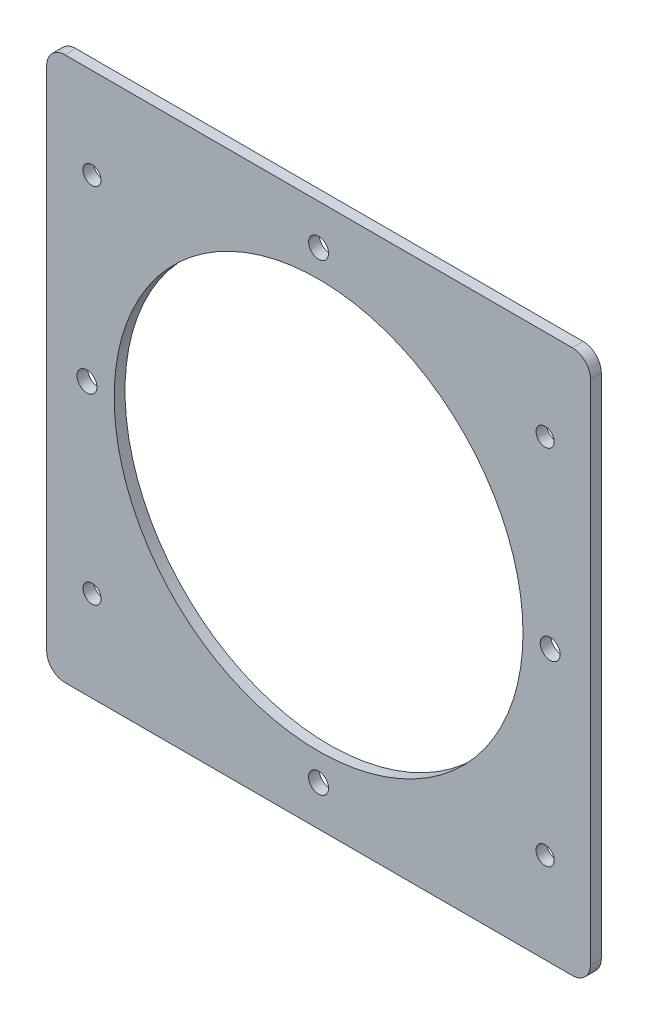
ISO-10303-21;
HEADER;
FILE_DESCRIPTION(('STEP AP214'),'2;1');
FILE_NAME('part.step','',(''),(''),'','','');
FILE_SCHEMA(('AUTOMOTIVE_DESIGN { 1 0 10303 214 1 1 1 1 }'));
ENDSEC;
DATA;
#1=APPLICATION_CONTEXT('core data for automotive mechanical design processes');
#2=APPLICATION_PROTOCOL_DEFINITION('international standard','automotive_design',2000,#1);
#3=PRODUCT_CONTEXT('',#1,'mechanical');
#4=PRODUCT('Part','Part','',(#3));
#5=PRODUCT_RELATED_PRODUCT_CATEGORY('part','',(#4));
#6=PRODUCT_DEFINITION_FORMATION('','',#4);
#7=PRODUCT_DEFINITION_CONTEXT('part definition',#1,'design');
#8=PRODUCT_DEFINITION('design','',#6,#7);
#9=PRODUCT_DEFINITION_SHAPE('','',#8);
#10=(LENGTH_UNIT() NAMED_UNIT(*) SI_UNIT(.MILLI.,.METRE.));
#11=(NAMED_UNIT(*) PLANE_ANGLE_UNIT() SI_UNIT($,.RADIAN.));
#12=(NAMED_UNIT(*) SI_UNIT($,.STERADIAN.) SOLID_ANGLE_UNIT());
#13=UNCERTAINTY_MEASURE_WITH_UNIT(LENGTH_MEASURE(1.E-05),#10,'distance_accuracy_value','');
#14=(GEOMETRIC_REPRESENTATION_CONTEXT(3) GLOBAL_UNCERTAINTY_ASSIGNED_CONTEXT((#13)) GLOBAL_UNIT_ASSIGNED_CONTEXT((#10,
#11,#12)) REPRESENTATION_CONTEXT('',''));
#15=CARTESIAN_POINT('',(0.,0.,0.));
#16=DIRECTION('',(0.,0.,1.));
#17=DIRECTION('',(1.,0.,0.));
#18=AXIS2_PLACEMENT_3D('',#15,#16,#17);
#19=CARTESIAN_POINT('',(75.,75.,1.5));
#20=DIRECTION('',(-1.,0.,0.));
#21=DIRECTION('',(0.,0.,1.));
#22=AXIS2_PLACEMENT_3D('',#19,#20,#21);
#23=PLANE('',#22);
#24=DIRECTION('',(0.,1.,0.));
#25=VECTOR('',#24,1.);
#26=CARTESIAN_POINT('',(75.,75.,1.5));
#27=LINE('',#26,#25);
#28=CARTESIAN_POINT('',(75.,-70.,1.5));
#29=VERTEX_POINT('',#28);
#30=CARTESIAN_POINT('',(75.,70.,1.5));
#31=VERTEX_POINT('',#30);
#32=EDGE_CURVE('E133',#29,#31,#27,.T.);
#33=ORIENTED_EDGE('',*,*,#32,.F.);
#34=DIRECTION('',(0.,0.,-1.));
#35=VECTOR('',#34,1.);
#36=CARTESIAN_POINT('',(75.,-70.,1.5));
#37=LINE('',#36,#35);
#38=CARTESIAN_POINT('',(75.,-70.,-1.5));
#39=VERTEX_POINT('',#38);
#40=EDGE_CURVE('E117',#29,#39,#37,.T.);
#41=ORIENTED_EDGE('',*,*,#40,.T.);
#42=DIRECTION('',(0.,1.,0.));
#43=VECTOR('',#42,1.);
#44=CARTESIAN_POINT('',(75.,75.,-1.5));
#45=LINE('',#44,#43);
#46=CARTESIAN_POINT('',(75.,70.,-1.5));
#47=VERTEX_POINT('',#46);
#48=EDGE_CURVE('E130',#39,#47,#45,.T.);
#49=ORIENTED_EDGE('',*,*,#48,.T.);
#50=DIRECTION('',(0.,0.,-1.));
#51=VECTOR('',#50,1.);
#52=CARTESIAN_POINT('',(75.,70.,1.5));
#53=LINE('',#52,#51);
#54=EDGE_CURVE('E136',#47,#31,#53,.F.);
#55=ORIENTED_EDGE('',*,*,#54,.T.);
#56=EDGE_LOOP('',(#33,#41,#49,#55));
#57=FACE_BOUND('',#56,.T.);
#58=ADVANCED_FACE('F45',(#57),#23,.F.);
#59=CARTESIAN_POINT('',(-75.,75.,1.5));
#60=DIRECTION('',(0.,-1.,0.));
#61=DIRECTION('',(0.,0.,-1.));
#62=AXIS2_PLACEMENT_3D('',#59,#60,#61);
#63=PLANE('',#62);
#64=DIRECTION('',(-1.,0.,0.));
#65=VECTOR('',#64,1.);
#66=CARTESIAN_POINT('',(-75.,75.,1.5));
#67=LINE('',#66,#65);
#68=CARTESIAN_POINT('',(70.,75.,1.5));
#69=VERTEX_POINT('',#68);
#70=CARTESIAN_POINT('',(-70.,75.,1.5));
#71=VERTEX_POINT('',#70);
#72=EDGE_CURVE('E196',#69,#71,#67,.T.);
#73=ORIENTED_EDGE('',*,*,#72,.F.);
#74=DIRECTION('',(0.,0.,-1.));
#75=VECTOR('',#74,1.);
#76=CARTESIAN_POINT('',(70.,75.,1.5));
#77=LINE('',#76,#75);
#78=CARTESIAN_POINT('',(70.,75.,-1.5));
#79=VERTEX_POINT('',#78);
#80=EDGE_CURVE('E11',#69,#79,#77,.T.);
#81=ORIENTED_EDGE('',*,*,#80,.T.);
#82=DIRECTION('',(-1.,0.,0.));
#83=VECTOR('',#82,1.);
#84=CARTESIAN_POINT('',(-75.,75.,-1.5));
#85=LINE('',#84,#83);
#86=CARTESIAN_POINT('',(-70.,75.,-1.5));
#87=VERTEX_POINT('',#86);
#88=EDGE_CURVE('E142',#79,#87,#85,.T.);
#89=ORIENTED_EDGE('',*,*,#88,.T.);
#90=DIRECTION('',(0.,0.,-1.));
#91=VECTOR('',#90,1.);
#92=CARTESIAN_POINT('',(-70.,75.,1.5));
#93=LINE('',#92,#91);
#94=EDGE_CURVE('E54',#87,#71,#93,.F.);
#95=ORIENTED_EDGE('',*,*,#94,.T.);
#96=EDGE_LOOP('',(#73,#81,#89,#95));
#97=FACE_BOUND('',#96,.T.);
#98=ADVANCED_FACE('F195',(#97),#63,.F.);
#99=CARTESIAN_POINT('',(-75.,75.,1.5));
#100=DIRECTION('',(1.,0.,0.));
#101=DIRECTION('',(0.,0.,-1.));
#102=AXIS2_PLACEMENT_3D('',#99,#100,#101);
#103=PLANE('',#102);
#104=DIRECTION('',(0.,-1.,0.));
#105=VECTOR('',#104,1.);
#106=CARTESIAN_POINT('',(-75.,75.,-1.5));
#107=LINE('',#106,#105);
#108=CARTESIAN_POINT('',(-75.,70.,-1.5));
#109=VERTEX_POINT('',#108);
#110=CARTESIAN_POINT('',(-75.,-70.,-1.5));
#111=VERTEX_POINT('',#110);
#112=EDGE_CURVE('E148',#109,#111,#107,.T.);
#113=ORIENTED_EDGE('',*,*,#112,.T.);
#114=DIRECTION('',(0.,0.,-1.));
#115=VECTOR('',#114,1.);
#116=CARTESIAN_POINT('',(-75.,-70.,1.5));
#117=LINE('',#116,#115);
#118=CARTESIAN_POINT('',(-75.,-70.,1.5));
#119=VERTEX_POINT('',#118);
#120=EDGE_CURVE('E61',#111,#119,#117,.F.);
#121=ORIENTED_EDGE('',*,*,#120,.T.);
#122=DIRECTION('',(0.,-1.,0.));
#123=VECTOR('',#122,1.);
#124=CARTESIAN_POINT('',(-75.,75.,1.5));
#125=LINE('',#124,#123);
#126=CARTESIAN_POINT('',(-75.,70.,1.5));
#127=VERTEX_POINT('',#126);
#128=EDGE_CURVE('E203',#127,#119,#125,.T.);
#129=ORIENTED_EDGE('',*,*,#128,.F.);
#130=DIRECTION('',(0.,0.,-1.));
#131=VECTOR('',#130,1.);
#132=CARTESIAN_POINT('',(-75.,70.,1.5));
#133=LINE('',#132,#131);
#134=EDGE_CURVE('E186',#127,#109,#133,.T.);
#135=ORIENTED_EDGE('',*,*,#134,.T.);
#136=EDGE_LOOP('',(#113,#121,#129,#135));
#137=FACE_BOUND('',#136,.T.);
#138=ADVANCED_FACE('F207',(#137),#103,.F.);
#139=CARTESIAN_POINT('',(-75.,-75.,1.5));
#140=DIRECTION('',(0.,1.,0.));
#141=DIRECTION('',(0.,0.,1.));
#142=AXIS2_PLACEMENT_3D('',#139,#140,#141);
#143=PLANE('',#142);
#144=DIRECTION('',(1.,0.,0.));
#145=VECTOR('',#144,1.);
#146=CARTESIAN_POINT('',(-75.,-75.,-1.5));
#147=LINE('',#146,#145);
#148=CARTESIAN_POINT('',(-70.,-75.,-1.5));
#149=VERTEX_POINT('',#148);
#150=CARTESIAN_POINT('',(70.,-75.,-1.5));
#151=VERTEX_POINT('',#150);
#152=EDGE_CURVE('E159',#149,#151,#147,.T.);
#153=ORIENTED_EDGE('',*,*,#152,.T.);
#154=DIRECTION('',(0.,0.,-1.));
#155=VECTOR('',#154,1.);
#156=CARTESIAN_POINT('',(70.,-75.,1.5));
#157=LINE('',#156,#155);
#158=CARTESIAN_POINT('',(70.,-75.,1.5));
#159=VERTEX_POINT('',#158);
#160=EDGE_CURVE('E118',#151,#159,#157,.F.);
#161=ORIENTED_EDGE('',*,*,#160,.T.);
#162=DIRECTION('',(1.,0.,0.));
#163=VECTOR('',#162,1.);
#164=CARTESIAN_POINT('',(-75.,-75.,1.5));
#165=LINE('',#164,#163);
#166=CARTESIAN_POINT('',(-70.,-75.,1.5));
#167=VERTEX_POINT('',#166);
#168=EDGE_CURVE('E154',#167,#159,#165,.T.);
#169=ORIENTED_EDGE('',*,*,#168,.F.);
#170=DIRECTION('',(0.,0.,-1.));
#171=VECTOR('',#170,1.);
#172=CARTESIAN_POINT('',(-70.,-75.,1.5));
#173=LINE('',#172,#171);
#174=EDGE_CURVE('E124',#167,#149,#173,.T.);
#175=ORIENTED_EDGE('',*,*,#174,.T.);
#176=EDGE_LOOP('',(#153,#161,#169,#175));
#177=FACE_BOUND('',#176,.T.);
#178=ADVANCED_FACE('F214',(#177),#143,.F.);
#179=CARTESIAN_POINT('',(0.,0.,1.5));
#180=DIRECTION('',(0.,0.,1.));
#181=DIRECTION('',(1.,0.,0.));
#182=AXIS2_PLACEMENT_3D('',#179,#180,#181);
#183=PLANE('',#182);
#184=CARTESIAN_POINT('',(62.5,50.,1.5));
#185=DIRECTION('',(0.,0.,1.));
#186=DIRECTION('',(-1.,0.,0.));
#187=AXIS2_PLACEMENT_3D('',#184,#185,#186);
#188=CIRCLE('',#187,2.50000000000001);
#189=CARTESIAN_POINT('',(60.,50.,1.5));
#190=VERTEX_POINT('',#189);
#191=EDGE_CURVE('E264',#190,#190,#188,.T.);
#192=ORIENTED_EDGE('',*,*,#191,.F.);
#193=EDGE_LOOP('',(#192));
#194=FACE_BOUND('',#193,.T.);
#195=CARTESIAN_POINT('',(62.5,-50.,1.5));
#196=DIRECTION('',(0.,0.,1.));
#197=DIRECTION('',(1.,0.,0.));
#198=AXIS2_PLACEMENT_3D('',#195,#196,#197);
#199=CIRCLE('',#198,2.50000000000001);
#200=CARTESIAN_POINT('',(65.,-50.,1.5));
#201=VERTEX_POINT('',#200);
#202=EDGE_CURVE('E273',#201,#201,#199,.T.);
#203=ORIENTED_EDGE('',*,*,#202,.F.);
#204=EDGE_LOOP('',(#203));
#205=FACE_BOUND('',#204,.T.);
#206=CARTESIAN_POINT('',(-62.5,-50.,1.5));
#207=DIRECTION('',(0.,0.,1.));
#208=DIRECTION('',(-1.,0.,0.));
#209=AXIS2_PLACEMENT_3D('',#206,#207,#208);
#210=CIRCLE('',#209,2.50000000000001);
#211=CARTESIAN_POINT('',(-65.,-50.,1.5));
#212=VERTEX_POINT('',#211);
#213=EDGE_CURVE('E263',#212,#212,#210,.T.);
#214=ORIENTED_EDGE('',*,*,#213,.F.);
#215=EDGE_LOOP('',(#214));
#216=FACE_BOUND('',#215,.T.);
#217=CARTESIAN_POINT('',(-62.5,50.,1.5));
#218=DIRECTION('',(0.,0.,1.));
#219=DIRECTION('',(1.,0.,0.));
#220=AXIS2_PLACEMENT_3D('',#217,#218,#219);
#221=CIRCLE('',#220,2.50000000000001);
#222=CARTESIAN_POINT('',(-60.,50.,1.5));
#223=VERTEX_POINT('',#222);
#224=EDGE_CURVE('E259',#223,#223,#221,.T.);
#225=ORIENTED_EDGE('',*,*,#224,.F.);
#226=EDGE_LOOP('',(#225));
#227=FACE_BOUND('',#226,.T.);
#228=CARTESIAN_POINT('',(0.,0.,1.5));
#229=DIRECTION('',(0.,0.,1.));
#230=DIRECTION('',(1.,0.,0.));
#231=AXIS2_PLACEMENT_3D('',#228,#229,#230);
#232=CIRCLE('',#231,56.4);
#233=CARTESIAN_POINT('',(56.4,0.,1.5));
#234=VERTEX_POINT('',#233);
#235=EDGE_CURVE('E251',#234,#234,#232,.T.);
#236=ORIENTED_EDGE('',*,*,#235,.F.);
#237=EDGE_LOOP('',(#236));
#238=FACE_BOUND('',#237,.T.);
#239=CARTESIAN_POINT('',(0.,63.9,1.5));
#240=DIRECTION('',(0.,0.,1.));
#241=DIRECTION('',(1.,0.,0.));
#242=AXIS2_PLACEMENT_3D('',#239,#240,#241);
#243=CIRCLE('',#242,2.75);
#244=CARTESIAN_POINT('',(2.75,63.9,1.5));
#245=VERTEX_POINT('',#244);
#246=EDGE_CURVE('E151',#245,#245,#243,.T.);
#247=ORIENTED_EDGE('',*,*,#246,.F.);
#248=EDGE_LOOP('',(#247));
#249=FACE_BOUND('',#248,.T.);
#250=CARTESIAN_POINT('',(63.9,-2.23105657552076E-13,1.5));
#251=DIRECTION('',(0.,0.,1.));
#252=DIRECTION('',(1.,0.,0.));
#253=AXIS2_PLACEMENT_3D('',#250,#251,#252);
#254=CIRCLE('',#253,2.75);
#255=CARTESIAN_POINT('',(66.65,-2.23105657552076E-13,1.5));
#256=VERTEX_POINT('',#255);
#257=EDGE_CURVE('E238',#256,#256,#254,.T.);
#258=ORIENTED_EDGE('',*,*,#257,.F.);
#259=EDGE_LOOP('',(#258));
#260=FACE_BOUND('',#259,.T.);
#261=CARTESIAN_POINT('',(-4.46211315104152E-13,-63.9,1.5));
#262=DIRECTION('',(0.,0.,1.));
#263=DIRECTION('',(1.,0.,0.));
#264=AXIS2_PLACEMENT_3D('',#261,#262,#263);
#265=CIRCLE('',#264,2.75);
#266=CARTESIAN_POINT('',(2.74999999999956,-63.9,1.5));
#267=VERTEX_POINT('',#266);
#268=EDGE_CURVE('E230',#267,#267,#265,.T.);
#269=ORIENTED_EDGE('',*,*,#268,.F.);
#270=EDGE_LOOP('',(#269));
#271=FACE_BOUND('',#270,.T.);
#272=CARTESIAN_POINT('',(-63.9,6.69316972656229E-13,1.5));
#273=DIRECTION('',(0.,0.,1.));
#274=DIRECTION('',(1.,0.,0.));
#275=AXIS2_PLACEMENT_3D('',#272,#273,#274);
#276=CIRCLE('',#275,2.75);
#277=CARTESIAN_POINT('',(-61.15,6.69316972656229E-13,1.5));
#278=VERTEX_POINT('',#277);
#279=EDGE_CURVE('E220',#278,#278,#276,.T.);
#280=ORIENTED_EDGE('',*,*,#279,.F.);
#281=EDGE_LOOP('',(#280));
#282=FACE_BOUND('',#281,.T.);
#283=ORIENTED_EDGE('',*,*,#168,.T.);
#284=CARTESIAN_POINT('',(70.,-70.,1.5));
#285=DIRECTION('',(0.,0.,1.));
#286=DIRECTION('',(1.,0.,0.));
#287=AXIS2_PLACEMENT_3D('',#284,#285,#286);
#288=CIRCLE('',#287,5.);
#289=EDGE_CURVE('E183',#159,#29,#288,.T.);
#290=ORIENTED_EDGE('',*,*,#289,.T.);
#291=ORIENTED_EDGE('',*,*,#32,.T.);
#292=CARTESIAN_POINT('',(70.,70.,1.5));
#293=DIRECTION('',(0.,0.,1.));
#294=DIRECTION('',(1.,0.,0.));
#295=AXIS2_PLACEMENT_3D('',#292,#293,#294);
#296=CIRCLE('',#295,5.);
#297=EDGE_CURVE('E177',#31,#69,#296,.T.);
#298=ORIENTED_EDGE('',*,*,#297,.T.);
#299=ORIENTED_EDGE('',*,*,#72,.T.);
#300=CARTESIAN_POINT('',(-70.,70.,1.5));
#301=DIRECTION('',(0.,0.,1.));
#302=DIRECTION('',(1.,0.,0.));
#303=AXIS2_PLACEMENT_3D('',#300,#301,#302);
#304=CIRCLE('',#303,5.);
#305=EDGE_CURVE('E68',#71,#127,#304,.T.);
#306=ORIENTED_EDGE('',*,*,#305,.T.);
#307=ORIENTED_EDGE('',*,*,#128,.T.);
#308=CARTESIAN_POINT('',(-70.,-70.,1.5));
#309=DIRECTION('',(0.,0.,1.));
#310=DIRECTION('',(1.,0.,0.));
#311=AXIS2_PLACEMENT_3D('',#308,#309,#310);
#312=CIRCLE('',#311,5.);
#313=EDGE_CURVE('E180',#119,#167,#312,.T.);
#314=ORIENTED_EDGE('',*,*,#313,.T.);
#315=EDGE_LOOP('',(#283,#290,#291,#298,#299,#306,#307,#314));
#316=FACE_BOUND('',#315,.T.);
#317=ADVANCED_FACE('F200',(#194,#205,#216,#227,#238,#249,#260,#271,#282,#316),#183,.T.);
#318=CARTESIAN_POINT('',(0.,0.,-1.5));
#319=DIRECTION('',(0.,0.,1.));
#320=DIRECTION('',(1.,0.,0.));
#321=AXIS2_PLACEMENT_3D('',#318,#319,#320);
#322=PLANE('',#321);
#323=CARTESIAN_POINT('',(62.5,50.,-1.5));
#324=DIRECTION('',(0.,0.,1.));
#325=DIRECTION('',(-1.,0.,0.));
#326=AXIS2_PLACEMENT_3D('',#323,#324,#325);
#327=CIRCLE('',#326,2.50000000000001);
#328=CARTESIAN_POINT('',(60.,50.,-1.5));
#329=VERTEX_POINT('',#328);
#330=EDGE_CURVE('E269',#329,#329,#327,.T.);
#331=ORIENTED_EDGE('',*,*,#330,.T.);
#332=EDGE_LOOP('',(#331));
#333=FACE_BOUND('',#332,.T.);
#334=CARTESIAN_POINT('',(62.5,-50.,-1.5));
#335=DIRECTION('',(0.,0.,1.));
#336=DIRECTION('',(1.,0.,0.));
#337=AXIS2_PLACEMENT_3D('',#334,#335,#336);
#338=CIRCLE('',#337,2.50000000000001);
#339=CARTESIAN_POINT('',(65.,-50.,-1.5));
#340=VERTEX_POINT('',#339);
#341=EDGE_CURVE('E268',#340,#340,#338,.T.);
#342=ORIENTED_EDGE('',*,*,#341,.T.);
#343=EDGE_LOOP('',(#342));
#344=FACE_BOUND('',#343,.T.);
#345=CARTESIAN_POINT('',(-62.5,-50.,-1.5));
#346=DIRECTION('',(0.,0.,1.));
#347=DIRECTION('',(-1.,0.,0.));
#348=AXIS2_PLACEMENT_3D('',#345,#346,#347);
#349=CIRCLE('',#348,2.50000000000001);
#350=CARTESIAN_POINT('',(-65.,-50.,-1.5));
#351=VERTEX_POINT('',#350);
#352=EDGE_CURVE('E277',#351,#351,#349,.T.);
#353=ORIENTED_EDGE('',*,*,#352,.T.);
#354=EDGE_LOOP('',(#353));
#355=FACE_BOUND('',#354,.T.);
#356=CARTESIAN_POINT('',(-62.5,50.,-1.5));
#357=DIRECTION('',(0.,0.,1.));
#358=DIRECTION('',(1.,0.,0.));
#359=AXIS2_PLACEMENT_3D('',#356,#357,#358);
#360=CIRCLE('',#359,2.50000000000001);
#361=CARTESIAN_POINT('',(-60.,50.,-1.5));
#362=VERTEX_POINT('',#361);
#363=EDGE_CURVE('E255',#362,#362,#360,.T.);
#364=ORIENTED_EDGE('',*,*,#363,.T.);
#365=EDGE_LOOP('',(#364));
#366=FACE_BOUND('',#365,.T.);
#367=CARTESIAN_POINT('',(0.,0.,-1.5));
#368=DIRECTION('',(0.,0.,1.));
#369=DIRECTION('',(1.,0.,0.));
#370=AXIS2_PLACEMENT_3D('',#367,#368,#369);
#371=CIRCLE('',#370,56.4);
#372=CARTESIAN_POINT('',(56.4,0.,-1.5));
#373=VERTEX_POINT('',#372);
#374=EDGE_CURVE('E229',#373,#373,#371,.T.);
#375=ORIENTED_EDGE('',*,*,#374,.T.);
#376=EDGE_LOOP('',(#375));
#377=FACE_BOUND('',#376,.T.);
#378=CARTESIAN_POINT('',(0.,63.9,-1.5));
#379=DIRECTION('',(0.,0.,1.));
#380=DIRECTION('',(1.,0.,0.));
#381=AXIS2_PLACEMENT_3D('',#378,#379,#380);
#382=CIRCLE('',#381,2.75);
#383=CARTESIAN_POINT('',(2.75,63.9,-1.5));
#384=VERTEX_POINT('',#383);
#385=EDGE_CURVE('E143',#384,#384,#382,.T.);
#386=ORIENTED_EDGE('',*,*,#385,.T.);
#387=EDGE_LOOP('',(#386));
#388=FACE_BOUND('',#387,.T.);
#389=CARTESIAN_POINT('',(63.9,-2.23105657552076E-13,-1.5));
#390=DIRECTION('',(0.,0.,1.));
#391=DIRECTION('',(1.,0.,0.));
#392=AXIS2_PLACEMENT_3D('',#389,#390,#391);
#393=CIRCLE('',#392,2.75);
#394=CARTESIAN_POINT('',(66.65,-2.23105657552076E-13,-1.5));
#395=VERTEX_POINT('',#394);
#396=EDGE_CURVE('E234',#395,#395,#393,.T.);
#397=ORIENTED_EDGE('',*,*,#396,.T.);
#398=EDGE_LOOP('',(#397));
#399=FACE_BOUND('',#398,.T.);
#400=CARTESIAN_POINT('',(-4.46211315104152E-13,-63.9,-1.5));
#401=DIRECTION('',(0.,0.,1.));
#402=DIRECTION('',(1.,0.,0.));
#403=AXIS2_PLACEMENT_3D('',#400,#401,#402);
#404=CIRCLE('',#403,2.75);
#405=CARTESIAN_POINT('',(2.74999999999956,-63.9,-1.5));
#406=VERTEX_POINT('',#405);
#407=EDGE_CURVE('E224',#406,#406,#404,.T.);
#408=ORIENTED_EDGE('',*,*,#407,.T.);
#409=EDGE_LOOP('',(#408));
#410=FACE_BOUND('',#409,.T.);
#411=CARTESIAN_POINT('',(-63.9,6.69316972656229E-13,-1.5));
#412=DIRECTION('',(0.,0.,1.));
#413=DIRECTION('',(1.,0.,0.));
#414=AXIS2_PLACEMENT_3D('',#411,#412,#413);
#415=CIRCLE('',#414,2.75);
#416=CARTESIAN_POINT('',(-61.15,6.69316972656229E-13,-1.5));
#417=VERTEX_POINT('',#416);
#418=EDGE_CURVE('E225',#417,#417,#415,.T.);
#419=ORIENTED_EDGE('',*,*,#418,.T.);
#420=EDGE_LOOP('',(#419));
#421=FACE_BOUND('',#420,.T.);
#422=ORIENTED_EDGE('',*,*,#48,.F.);
#423=CARTESIAN_POINT('',(70.,-70.,-1.5));
#424=DIRECTION('',(0.,0.,1.));
#425=DIRECTION('',(1.,0.,0.));
#426=AXIS2_PLACEMENT_3D('',#423,#424,#425);
#427=CIRCLE('',#426,5.);
#428=EDGE_CURVE('E113',#39,#151,#427,.F.);
#429=ORIENTED_EDGE('',*,*,#428,.T.);
#430=ORIENTED_EDGE('',*,*,#152,.F.);
#431=CARTESIAN_POINT('',(-70.,-70.,-1.5));
#432=DIRECTION('',(0.,0.,1.));
#433=DIRECTION('',(1.,0.,0.));
#434=AXIS2_PLACEMENT_3D('',#431,#432,#433);
#435=CIRCLE('',#434,5.);
#436=EDGE_CURVE('E125',#149,#111,#435,.F.);
#437=ORIENTED_EDGE('',*,*,#436,.T.);
#438=ORIENTED_EDGE('',*,*,#112,.F.);
#439=CARTESIAN_POINT('',(-70.,70.,-1.5));
#440=DIRECTION('',(0.,0.,1.));
#441=DIRECTION('',(1.,0.,0.));
#442=AXIS2_PLACEMENT_3D('',#439,#440,#441);
#443=CIRCLE('',#442,5.);
#444=EDGE_CURVE('E135',#109,#87,#443,.F.);
#445=ORIENTED_EDGE('',*,*,#444,.T.);
#446=ORIENTED_EDGE('',*,*,#88,.F.);
#447=CARTESIAN_POINT('',(70.,70.,-1.5));
#448=DIRECTION('',(0.,0.,1.));
#449=DIRECTION('',(1.,0.,0.));
#450=AXIS2_PLACEMENT_3D('',#447,#448,#449);
#451=CIRCLE('',#450,5.);
#452=EDGE_CURVE('E140',#79,#47,#451,.F.);
#453=ORIENTED_EDGE('',*,*,#452,.T.);
#454=EDGE_LOOP('',(#422,#429,#430,#437,#438,#445,#446,#453));
#455=FACE_BOUND('',#454,.T.);
#456=ADVANCED_FACE('F138',(#333,#344,#355,#366,#377,#388,#399,#410,#421,#455),#322,.F.);
#457=CARTESIAN_POINT('',(-63.9,6.69316972656229E-13,-1.5));
#458=DIRECTION('',(0.,0.,1.));
#459=DIRECTION('',(1.,0.,0.));
#460=AXIS2_PLACEMENT_3D('',#457,#458,#459);
#461=CYLINDRICAL_SURFACE('',#460,2.75);
#462=ORIENTED_EDGE('',*,*,#418,.F.);
#463=EDGE_LOOP('',(#462));
#464=FACE_BOUND('',#463,.T.);
#465=ORIENTED_EDGE('',*,*,#279,.T.);
#466=EDGE_LOOP('',(#465));
#467=FACE_BOUND('',#466,.T.);
#468=ADVANCED_FACE('F314',(#464,#467),#461,.F.);
#469=CARTESIAN_POINT('',(-4.46211315104152E-13,-63.9,-1.5));
#470=DIRECTION('',(0.,0.,1.));
#471=DIRECTION('',(1.,0.,0.));
#472=AXIS2_PLACEMENT_3D('',#469,#470,#471);
#473=CYLINDRICAL_SURFACE('',#472,2.75);
#474=ORIENTED_EDGE('',*,*,#407,.F.);
#475=EDGE_LOOP('',(#474));
#476=FACE_BOUND('',#475,.T.);
#477=ORIENTED_EDGE('',*,*,#268,.T.);
#478=EDGE_LOOP('',(#477));
#479=FACE_BOUND('',#478,.T.);
#480=ADVANCED_FACE('F316',(#476,#479),#473,.F.);
#481=CARTESIAN_POINT('',(63.9,-2.23105657552076E-13,-1.5));
#482=DIRECTION('',(0.,0.,1.));
#483=DIRECTION('',(1.,0.,0.));
#484=AXIS2_PLACEMENT_3D('',#481,#482,#483);
#485=CYLINDRICAL_SURFACE('',#484,2.75);
#486=ORIENTED_EDGE('',*,*,#396,.F.);
#487=EDGE_LOOP('',(#486));
#488=FACE_BOUND('',#487,.T.);
#489=ORIENTED_EDGE('',*,*,#257,.T.);
#490=EDGE_LOOP('',(#489));
#491=FACE_BOUND('',#490,.T.);
#492=ADVANCED_FACE('F322',(#488,#491),#485,.F.);
#493=CARTESIAN_POINT('',(0.,63.9,-1.5));
#494=DIRECTION('',(0.,0.,1.));
#495=DIRECTION('',(1.,0.,0.));
#496=AXIS2_PLACEMENT_3D('',#493,#494,#495);
#497=CYLINDRICAL_SURFACE('',#496,2.75);
#498=ORIENTED_EDGE('',*,*,#385,.F.);
#499=EDGE_LOOP('',(#498));
#500=FACE_BOUND('',#499,.T.);
#501=ORIENTED_EDGE('',*,*,#246,.T.);
#502=EDGE_LOOP('',(#501));
#503=FACE_BOUND('',#502,.T.);
#504=ADVANCED_FACE('F409',(#500,#503),#497,.F.);
#505=CARTESIAN_POINT('',(0.,0.,-1.5));
#506=DIRECTION('',(0.,0.,1.));
#507=DIRECTION('',(1.,0.,0.));
#508=AXIS2_PLACEMENT_3D('',#505,#506,#507);
#509=CYLINDRICAL_SURFACE('',#508,56.4);
#510=ORIENTED_EDGE('',*,*,#374,.F.);
#511=EDGE_LOOP('',(#510));
#512=FACE_BOUND('',#511,.T.);
#513=ORIENTED_EDGE('',*,*,#235,.T.);
#514=EDGE_LOOP('',(#513));
#515=FACE_BOUND('',#514,.T.);
#516=ADVANCED_FACE('F399',(#512,#515),#509,.F.);
#517=CARTESIAN_POINT('',(-62.5,50.,-1.5));
#518=DIRECTION('',(0.,0.,1.));
#519=DIRECTION('',(1.,0.,0.));
#520=AXIS2_PLACEMENT_3D('',#517,#518,#519);
#521=CYLINDRICAL_SURFACE('',#520,2.50000000000001);
#522=ORIENTED_EDGE('',*,*,#363,.F.);
#523=EDGE_LOOP('',(#522));
#524=FACE_BOUND('',#523,.T.);
#525=ORIENTED_EDGE('',*,*,#224,.T.);
#526=EDGE_LOOP('',(#525));
#527=FACE_BOUND('',#526,.T.);
#528=ADVANCED_FACE('F294',(#524,#527),#521,.F.);
#529=CARTESIAN_POINT('',(-62.5,-50.,-1.5));
#530=DIRECTION('',(0.,0.,1.));
#531=DIRECTION('',(1.,0.,0.));
#532=AXIS2_PLACEMENT_3D('',#529,#530,#531);
#533=CYLINDRICAL_SURFACE('',#532,2.50000000000001);
#534=ORIENTED_EDGE('',*,*,#352,.F.);
#535=EDGE_LOOP('',(#534));
#536=FACE_BOUND('',#535,.T.);
#537=ORIENTED_EDGE('',*,*,#213,.T.);
#538=EDGE_LOOP('',(#537));
#539=FACE_BOUND('',#538,.T.);
#540=ADVANCED_FACE('F290',(#536,#539),#533,.F.);
#541=CARTESIAN_POINT('',(62.5,-50.,-1.5));
#542=DIRECTION('',(0.,0.,1.));
#543=DIRECTION('',(1.,0.,0.));
#544=AXIS2_PLACEMENT_3D('',#541,#542,#543);
#545=CYLINDRICAL_SURFACE('',#544,2.50000000000001);
#546=ORIENTED_EDGE('',*,*,#341,.F.);
#547=EDGE_LOOP('',(#546));
#548=FACE_BOUND('',#547,.T.);
#549=ORIENTED_EDGE('',*,*,#202,.T.);
#550=EDGE_LOOP('',(#549));
#551=FACE_BOUND('',#550,.T.);
#552=ADVANCED_FACE('F293',(#548,#551),#545,.F.);
#553=CARTESIAN_POINT('',(62.5,50.,-1.5));
#554=DIRECTION('',(0.,0.,1.));
#555=DIRECTION('',(1.,0.,0.));
#556=AXIS2_PLACEMENT_3D('',#553,#554,#555);
#557=CYLINDRICAL_SURFACE('',#556,2.50000000000001);
#558=ORIENTED_EDGE('',*,*,#330,.F.);
#559=EDGE_LOOP('',(#558));
#560=FACE_BOUND('',#559,.T.);
#561=ORIENTED_EDGE('',*,*,#191,.T.);
#562=EDGE_LOOP('',(#561));
#563=FACE_BOUND('',#562,.T.);
#564=ADVANCED_FACE('F340',(#560,#563),#557,.F.);
#565=CARTESIAN_POINT('',(70.,-70.,1.5));
#566=DIRECTION('',(0.,0.,-1.));
#567=DIRECTION('',(-1.,0.,0.));
#568=AXIS2_PLACEMENT_3D('',#565,#566,#567);
#569=CYLINDRICAL_SURFACE('',#568,5.);
#570=ORIENTED_EDGE('',*,*,#289,.F.);
#571=ORIENTED_EDGE('',*,*,#160,.F.);
#572=ORIENTED_EDGE('',*,*,#428,.F.);
#573=ORIENTED_EDGE('',*,*,#40,.F.);
#574=EDGE_LOOP('',(#570,#571,#572,#573));
#575=FACE_BOUND('',#574,.T.);
#576=ADVANCED_FACE('F116',(#575),#569,.T.);
#577=CARTESIAN_POINT('',(-70.,-70.,1.5));
#578=DIRECTION('',(0.,0.,-1.));
#579=DIRECTION('',(-1.,0.,0.));
#580=AXIS2_PLACEMENT_3D('',#577,#578,#579);
#581=CYLINDRICAL_SURFACE('',#580,5.);
#582=ORIENTED_EDGE('',*,*,#313,.F.);
#583=ORIENTED_EDGE('',*,*,#120,.F.);
#584=ORIENTED_EDGE('',*,*,#436,.F.);
#585=ORIENTED_EDGE('',*,*,#174,.F.);
#586=EDGE_LOOP('',(#582,#583,#584,#585));
#587=FACE_BOUND('',#586,.T.);
#588=ADVANCED_FACE('F211',(#587),#581,.T.);
#589=CARTESIAN_POINT('',(70.,70.,1.5));
#590=DIRECTION('',(0.,0.,-1.));
#591=DIRECTION('',(-1.,0.,0.));
#592=AXIS2_PLACEMENT_3D('',#589,#590,#591);
#593=CYLINDRICAL_SURFACE('',#592,5.);
#594=ORIENTED_EDGE('',*,*,#297,.F.);
#595=ORIENTED_EDGE('',*,*,#54,.F.);
#596=ORIENTED_EDGE('',*,*,#452,.F.);
#597=ORIENTED_EDGE('',*,*,#80,.F.);
#598=EDGE_LOOP('',(#594,#595,#596,#597));
#599=FACE_BOUND('',#598,.T.);
#600=ADVANCED_FACE('F342',(#599),#593,.T.);
#601=CARTESIAN_POINT('',(-70.,70.,1.5));
#602=DIRECTION('',(0.,0.,-1.));
#603=DIRECTION('',(-1.,0.,0.));
#604=AXIS2_PLACEMENT_3D('',#601,#602,#603);
#605=CYLINDRICAL_SURFACE('',#604,5.);
#606=ORIENTED_EDGE('',*,*,#305,.F.);
#607=ORIENTED_EDGE('',*,*,#94,.F.);
#608=ORIENTED_EDGE('',*,*,#444,.F.);
#609=ORIENTED_EDGE('',*,*,#134,.F.);
#610=EDGE_LOOP('',(#606,#607,#608,#609));
#611=FACE_BOUND('',#610,.T.);
#612=ADVANCED_FACE('F47',(#611),#605,.T.);
#613=CLOSED_SHELL('',(#58,#98,#138,#178,#317,#456,#468,#480,#492,#504,#516,#528,#540,#552,#564,
#576,#588,#600,#612));
#614=MANIFOLD_SOLID_BREP('B2',#613);
#615=ADVANCED_BREP_SHAPE_REPRESENTATION('',(#18,#614),#14);
#616=SHAPE_DEFINITION_REPRESENTATION(#9,#615);
ENDSEC;
END-ISO-10303-21;
